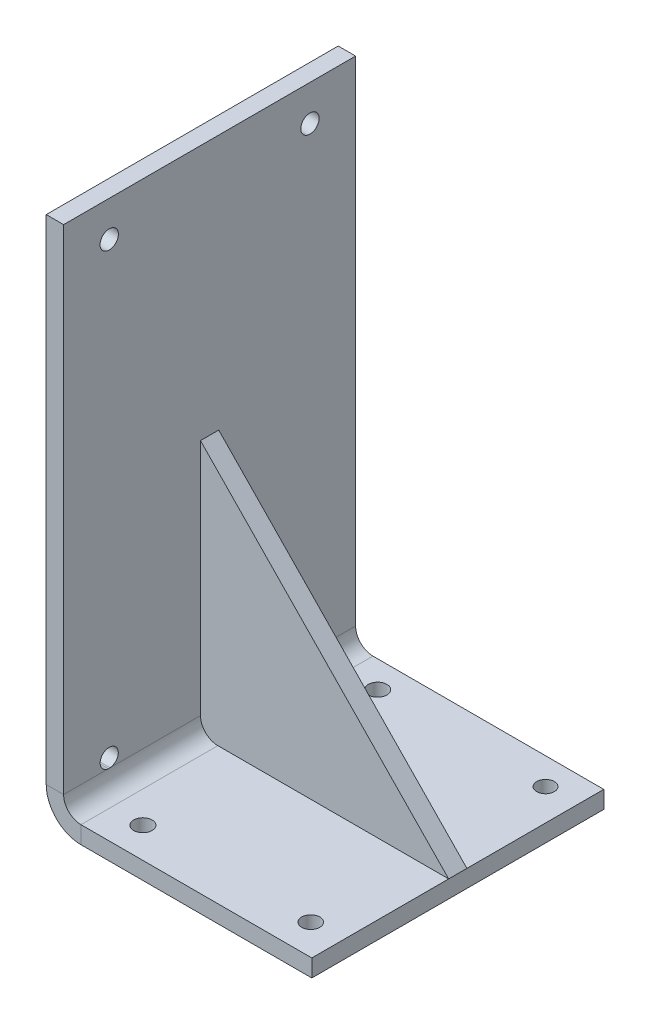
ISO-10303-21;
HEADER;
FILE_DESCRIPTION(('STEP AP214'),'2;1');
FILE_NAME('part.step','',(''),(''),'','','');
FILE_SCHEMA(('AUTOMOTIVE_DESIGN { 1 0 10303 214 1 1 1 1 }'));
ENDSEC;
DATA;
#1=APPLICATION_CONTEXT('core data for automotive mechanical design processes');
#2=APPLICATION_PROTOCOL_DEFINITION('international standard','automotive_design',2000,#1);
#3=PRODUCT_CONTEXT('',#1,'mechanical');
#4=PRODUCT('Part','Part','',(#3));
#5=PRODUCT_RELATED_PRODUCT_CATEGORY('part','',(#4));
#6=PRODUCT_DEFINITION_FORMATION('','',#4);
#7=PRODUCT_DEFINITION_CONTEXT('part definition',#1,'design');
#8=PRODUCT_DEFINITION('design','',#6,#7);
#9=PRODUCT_DEFINITION_SHAPE('','',#8);
#10=(LENGTH_UNIT() NAMED_UNIT(*) SI_UNIT(.MILLI.,.METRE.));
#11=(NAMED_UNIT(*) PLANE_ANGLE_UNIT() SI_UNIT($,.RADIAN.));
#12=(NAMED_UNIT(*) SI_UNIT($,.STERADIAN.) SOLID_ANGLE_UNIT());
#13=UNCERTAINTY_MEASURE_WITH_UNIT(LENGTH_MEASURE(1.E-05),#10,'distance_accuracy_value','');
#14=(GEOMETRIC_REPRESENTATION_CONTEXT(3) GLOBAL_UNCERTAINTY_ASSIGNED_CONTEXT((#13)) GLOBAL_UNIT_ASSIGNED_CONTEXT((#10,
#11,#12)) REPRESENTATION_CONTEXT('',''));
#15=CARTESIAN_POINT('',(0.,0.,0.));
#16=DIRECTION('',(0.,0.,1.));
#17=DIRECTION('',(1.,0.,0.));
#18=AXIS2_PLACEMENT_3D('',#15,#16,#17);
#19=CARTESIAN_POINT('',(4.7625,4.7625,40.));
#20=DIRECTION('',(0.,0.,-1.));
#21=DIRECTION('',(-1.,0.,0.));
#22=AXIS2_PLACEMENT_3D('',#19,#20,#21);
#23=CYLINDRICAL_SURFACE('',#22,9.525);
#24=CARTESIAN_POINT('',(-4.7625,4.7625,-27.2638198002494));
#25=CARTESIAN_POINT('',(-4.76249996387871,4.76062360908471,-27.2834810728059));
#26=CARTESIAN_POINT('',(-4.76249944415007,4.75897974606339,-27.3031645916626));
#27=CARTESIAN_POINT('',(-4.76249800522472,4.75616235389097,-27.3425316768141));
#28=CARTESIAN_POINT('',(-4.76249708670741,4.75498803130408,-27.3622151863417));
#29=CARTESIAN_POINT('',(-4.76249541493604,4.75310967775168,-27.4015822627205));
#30=CARTESIAN_POINT('',(-4.7624946614956,4.75240511457281,-27.421265804155));
#31=CARTESIAN_POINT('',(-4.76249362113549,4.75146595729511,-27.4606329013084));
#32=CARTESIAN_POINT('',(-4.76249333395082,4.75123109621351,-27.4803164506559));
#33=CARTESIAN_POINT('',(-4.76249333395082,4.75123109621351,-27.5196835493509));
#34=CARTESIAN_POINT('',(-4.76249362113549,4.75146595729511,-27.5393670986984));
#35=CARTESIAN_POINT('',(-4.7624946614956,4.75240511457281,-27.5787341958517));
#36=CARTESIAN_POINT('',(-4.76249541493604,4.75310967775168,-27.5984177372863));
#37=CARTESIAN_POINT('',(-4.76249708670741,4.75498803130408,-27.637784813665));
#38=CARTESIAN_POINT('',(-4.76249800522472,4.75616235389097,-27.6574683231927));
#39=CARTESIAN_POINT('',(-4.76249944415007,4.75897974606339,-27.6968354083441));
#40=CARTESIAN_POINT('',(-4.76249996387871,4.76062360908471,-27.7165189272008));
#41=CARTESIAN_POINT('',(-4.7625,4.7625,-27.7361801997574));
#42=B_SPLINE_CURVE_WITH_KNOTS('',3,(#24,#25,#26,#27,#28,#29,#30,#31,#32,#33,#34,#35,#36,#37,#38,
#39,#40,#41),.UNSPECIFIED.,.F.,.F.,(4,2,2,2,2,2,2,2,4),(0.,0.0592505212362607,0.118400492652685,
0.177483335787964,0.236532586165076,0.295581836542175,0.354664679677467,0.413814651093878,
0.473065172330139),.UNSPECIFIED.);
#43=CARTESIAN_POINT('',(-4.7625,4.7625,-27.2638198002494));
#44=VERTEX_POINT('',#43);
#45=CARTESIAN_POINT('',(-4.7625,4.7625,-27.7361801997574));
#46=VERTEX_POINT('',#45);
#47=EDGE_CURVE('E152',#44,#46,#42,.T.);
#48=ORIENTED_EDGE('',*,*,#47,.T.);
#49=DIRECTION('',(0.,0.,-1.));
#50=VECTOR('',#49,1.);
#51=CARTESIAN_POINT('',(-4.7625,4.7625,40.));
#52=LINE('',#51,#50);
#53=CARTESIAN_POINT('',(-4.7625,4.7625,-40.));
#54=VERTEX_POINT('',#53);
#55=EDGE_CURVE('E179',#46,#54,#52,.T.);
#56=ORIENTED_EDGE('',*,*,#55,.T.);
#57=CARTESIAN_POINT('',(4.7625,4.7625,-40.));
#58=DIRECTION('',(0.,0.,1.));
#59=DIRECTION('',(1.,0.,0.));
#60=AXIS2_PLACEMENT_3D('',#57,#58,#59);
#61=CIRCLE('',#60,9.525);
#62=CARTESIAN_POINT('',(4.7625,-4.7625,-40.));
#63=VERTEX_POINT('',#62);
#64=EDGE_CURVE('E270',#54,#63,#61,.T.);
#65=ORIENTED_EDGE('',*,*,#64,.T.);
#66=DIRECTION('',(0.,0.,-1.));
#67=VECTOR('',#66,1.);
#68=CARTESIAN_POINT('',(4.7625,-4.7625,40.));
#69=LINE('',#68,#67);
#70=CARTESIAN_POINT('',(4.7625,-4.7625,40.));
#71=VERTEX_POINT('',#70);
#72=EDGE_CURVE('E186',#71,#63,#69,.T.);
#73=ORIENTED_EDGE('',*,*,#72,.F.);
#74=CARTESIAN_POINT('',(4.7625,4.7625,40.));
#75=DIRECTION('',(0.,0.,1.));
#76=DIRECTION('',(1.,0.,0.));
#77=AXIS2_PLACEMENT_3D('',#74,#75,#76);
#78=CIRCLE('',#77,9.525);
#79=CARTESIAN_POINT('',(-4.7625,4.7625,40.));
#80=VERTEX_POINT('',#79);
#81=EDGE_CURVE('E298',#80,#71,#78,.T.);
#82=ORIENTED_EDGE('',*,*,#81,.F.);
#83=CARTESIAN_POINT('',(-4.7625,4.7625,27.7212775154937));
#84=VERTEX_POINT('',#83);
#85=EDGE_CURVE('E183',#80,#84,#52,.T.);
#86=ORIENTED_EDGE('',*,*,#85,.T.);
#87=DIRECTION('',(0.,0.,-1.));
#88=VECTOR('',#87,1.);
#89=CARTESIAN_POINT('',(-4.7625,4.7625,40.));
#90=LINE('',#89,#88);
#91=CARTESIAN_POINT('',(-4.7625,4.7625,27.2787224844996));
#92=VERTEX_POINT('',#91);
#93=EDGE_CURVE('E182',#84,#92,#90,.T.);
#94=ORIENTED_EDGE('',*,*,#93,.T.);
#95=EDGE_CURVE('E176',#92,#44,#52,.T.);
#96=ORIENTED_EDGE('',*,*,#95,.T.);
#97=EDGE_LOOP('',(#48,#56,#65,#73,#82,#86,#94,#96));
#98=FACE_BOUND('',#97,.T.);
#99=ADVANCED_FACE('F39',(#98),#23,.T.);
#100=CARTESIAN_POINT('',(0.,0.,40.));
#101=DIRECTION('',(0.,1.,0.));
#102=DIRECTION('',(0.,0.,1.));
#103=AXIS2_PLACEMENT_3D('',#100,#101,#102);
#104=PLANE('',#103);
#105=CARTESIAN_POINT('',(59.3690789778464,0.,-32.6724328944059));
#106=DIRECTION('',(0.,1.,0.));
#107=DIRECTION('',(0.,0.,1.));
#108=AXIS2_PLACEMENT_3D('',#105,#106,#107);
#109=CIRCLE('',#108,2.41391972015511);
#110=CARTESIAN_POINT('',(59.3690789778464,0.,-30.2585131742508));
#111=VERTEX_POINT('',#110);
#112=EDGE_CURVE('E676',#111,#111,#109,.T.);
#113=ORIENTED_EDGE('',*,*,#112,.F.);
#114=EDGE_LOOP('',(#113));
#115=FACE_BOUND('',#114,.T.);
#116=CARTESIAN_POINT('',(13.37310013689,0.,-32.6724328944059));
#117=DIRECTION('',(0.,1.,0.));
#118=DIRECTION('',(0.,0.,1.));
#119=AXIS2_PLACEMENT_3D('',#116,#117,#118);
#120=CIRCLE('',#119,2.53741440630367);
#121=CARTESIAN_POINT('',(13.37310013689,0.,-30.1350184881022));
#122=VERTEX_POINT('',#121);
#123=EDGE_CURVE('E673',#122,#122,#120,.T.);
#124=ORIENTED_EDGE('',*,*,#123,.F.);
#125=EDGE_LOOP('',(#124));
#126=FACE_BOUND('',#125,.T.);
#127=DIRECTION('',(0.,0.,-1.));
#128=VECTOR('',#127,1.);
#129=CARTESIAN_POINT('',(4.7625,0.,40.));
#130=LINE('',#129,#128);
#131=CARTESIAN_POINT('',(4.7625,0.,-2.5));
#132=VERTEX_POINT('',#131);
#133=CARTESIAN_POINT('',(4.7625,0.,-40.));
#134=VERTEX_POINT('',#133);
#135=EDGE_CURVE('E198',#132,#134,#130,.T.);
#136=ORIENTED_EDGE('',*,*,#135,.F.);
#137=DIRECTION('',(1.,0.,0.));
#138=VECTOR('',#137,1.);
#139=CARTESIAN_POINT('',(0.,0.,-2.5));
#140=LINE('',#139,#138);
#141=CARTESIAN_POINT('',(68.,0.,-2.5));
#142=VERTEX_POINT('',#141);
#143=EDGE_CURVE('E340',#132,#142,#140,.T.);
#144=ORIENTED_EDGE('',*,*,#143,.T.);
#145=DIRECTION('',(0.,0.,-1.));
#146=VECTOR('',#145,1.);
#147=CARTESIAN_POINT('',(68.,0.,40.));
#148=LINE('',#147,#146);
#149=CARTESIAN_POINT('',(68.,0.,-40.));
#150=VERTEX_POINT('',#149);
#151=EDGE_CURVE('E219',#142,#150,#148,.T.);
#152=ORIENTED_EDGE('',*,*,#151,.T.);
#153=DIRECTION('',(1.,0.,0.));
#154=VECTOR('',#153,1.);
#155=CARTESIAN_POINT('',(0.,0.,-40.));
#156=LINE('',#155,#154);
#157=EDGE_CURVE('E250',#134,#150,#156,.T.);
#158=ORIENTED_EDGE('',*,*,#157,.F.);
#159=EDGE_LOOP('',(#136,#144,#152,#158));
#160=FACE_BOUND('',#159,.T.);
#161=ADVANCED_FACE('F256',(#115,#126,#160),#104,.T.);
#162=CARTESIAN_POINT('',(4.7625,4.7625,40.));
#163=DIRECTION('',(0.,0.,-1.));
#164=DIRECTION('',(-1.,0.,0.));
#165=AXIS2_PLACEMENT_3D('',#162,#163,#164);
#166=CYLINDRICAL_SURFACE('',#165,4.7625);
#167=DIRECTION('',(0.,0.,-1.));
#168=VECTOR('',#167,1.);
#169=CARTESIAN_POINT('',(0.,4.7625,40.));
#170=LINE('',#169,#168);
#171=CARTESIAN_POINT('',(0.,4.7625,-2.5));
#172=VERTEX_POINT('',#171);
#173=CARTESIAN_POINT('',(0.,4.7625,-27.2638198002494));
#174=VERTEX_POINT('',#173);
#175=EDGE_CURVE('E206',#172,#174,#170,.T.);
#176=ORIENTED_EDGE('',*,*,#175,.F.);
#177=CARTESIAN_POINT('',(4.7625,4.7625,-2.5));
#178=DIRECTION('',(0.,0.,1.));
#179=DIRECTION('',(1.,0.,0.));
#180=AXIS2_PLACEMENT_3D('',#177,#178,#179);
#181=CIRCLE('',#180,4.7625);
#182=EDGE_CURVE('E243',#172,#132,#181,.T.);
#183=ORIENTED_EDGE('',*,*,#182,.T.);
#184=ORIENTED_EDGE('',*,*,#135,.T.);
#185=CARTESIAN_POINT('',(4.7625,4.7625,-40.));
#186=DIRECTION('',(0.,0.,-1.));
#187=DIRECTION('',(-1.,0.,0.));
#188=AXIS2_PLACEMENT_3D('',#185,#186,#187);
#189=CIRCLE('',#188,4.7625);
#190=CARTESIAN_POINT('',(0.,4.7625,-40.));
#191=VERTEX_POINT('',#190);
#192=EDGE_CURVE('E241',#191,#134,#189,.F.);
#193=ORIENTED_EDGE('',*,*,#192,.F.);
#194=CARTESIAN_POINT('',(0.,4.7625,-27.7361801997574));
#195=VERTEX_POINT('',#194);
#196=EDGE_CURVE('E193',#195,#191,#170,.T.);
#197=ORIENTED_EDGE('',*,*,#196,.F.);
#198=CARTESIAN_POINT('',(0.,4.7625,-27.2638198002494));
#199=CARTESIAN_POINT('',(0.,4.75493456892617,-27.4223804410417));
#200=CARTESIAN_POINT('',(0.,4.75503995690267,-27.5798283405828));
#201=CARTESIAN_POINT('',(0.,4.7625,-27.7361801997574));
#202=B_SPLINE_CURVE_WITH_KNOTS('',3,(#198,#199,#200,#201),.UNSPECIFIED.,.F.,.F.,(4,4),(0.,
0.000471084587811639),.UNSPECIFIED.);
#203=EDGE_CURVE('E159',#174,#195,#202,.T.);
#204=ORIENTED_EDGE('',*,*,#203,.F.);
#205=EDGE_LOOP('',(#176,#183,#184,#193,#197,#204));
#206=FACE_BOUND('',#205,.T.);
#207=ADVANCED_FACE('F238',(#206),#166,.F.);
#208=CARTESIAN_POINT('',(4.7625,0.,40.));
#209=DIRECTION('',(0.,0.,1.));
#210=DIRECTION('',(1.,0.,0.));
#211=AXIS2_PLACEMENT_3D('',#208,#209,#210);
#212=PLANE('',#211);
#213=DIRECTION('',(0.,-1.,0.));
#214=VECTOR('',#213,1.);
#215=CARTESIAN_POINT('',(4.7625,0.,40.));
#216=LINE('',#215,#214);
#217=CARTESIAN_POINT('',(4.7625,0.,40.));
#218=VERTEX_POINT('',#217);
#219=EDGE_CURVE('E11',#218,#71,#216,.T.);
#220=ORIENTED_EDGE('',*,*,#219,.F.);
#221=CARTESIAN_POINT('',(4.7625,4.7625,40.));
#222=DIRECTION('',(0.,0.,-1.));
#223=DIRECTION('',(-1.,0.,0.));
#224=AXIS2_PLACEMENT_3D('',#221,#222,#223);
#225=CIRCLE('',#224,4.7625);
#226=CARTESIAN_POINT('',(0.,4.7625,40.));
#227=VERTEX_POINT('',#226);
#228=EDGE_CURVE('E287',#227,#218,#225,.F.);
#229=ORIENTED_EDGE('',*,*,#228,.F.);
#230=DIRECTION('',(1.,0.,0.));
#231=VECTOR('',#230,1.);
#232=CARTESIAN_POINT('',(-4.7625,4.7625,40.));
#233=LINE('',#232,#231);
#234=EDGE_CURVE('E48',#80,#227,#233,.T.);
#235=ORIENTED_EDGE('',*,*,#234,.F.);
#236=ORIENTED_EDGE('',*,*,#81,.T.);
#237=EDGE_LOOP('',(#220,#229,#235,#236));
#238=FACE_BOUND('',#237,.T.);
#239=ADVANCED_FACE('F41',(#238),#212,.T.);
#240=CARTESIAN_POINT('',(-4.7625,4.7625,40.));
#241=DIRECTION('',(0.,0.,1.));
#242=DIRECTION('',(1.,0.,0.));
#243=AXIS2_PLACEMENT_3D('',#240,#241,#242);
#244=PLANE('',#243);
#245=DIRECTION('',(1.,0.,0.));
#246=VECTOR('',#245,1.);
#247=CARTESIAN_POINT('',(0.,0.,40.));
#248=LINE('',#247,#246);
#249=CARTESIAN_POINT('',(68.,0.,40.));
#250=VERTEX_POINT('',#249);
#251=EDGE_CURVE('E280',#218,#250,#248,.T.);
#252=ORIENTED_EDGE('',*,*,#251,.F.);
#253=ORIENTED_EDGE('',*,*,#219,.T.);
#254=DIRECTION('',(1.,0.,0.));
#255=VECTOR('',#254,1.);
#256=CARTESIAN_POINT('',(0.,-4.7625,40.));
#257=LINE('',#256,#255);
#258=CARTESIAN_POINT('',(68.,-4.7625,40.));
#259=VERTEX_POINT('',#258);
#260=EDGE_CURVE('E271',#71,#259,#257,.T.);
#261=ORIENTED_EDGE('',*,*,#260,.T.);
#262=DIRECTION('',(0.,-1.,0.));
#263=VECTOR('',#262,1.);
#264=CARTESIAN_POINT('',(68.,0.,40.));
#265=LINE('',#264,#263);
#266=EDGE_CURVE('E273',#250,#259,#265,.T.);
#267=ORIENTED_EDGE('',*,*,#266,.F.);
#268=EDGE_LOOP('',(#252,#253,#261,#267));
#269=FACE_BOUND('',#268,.T.);
#270=ADVANCED_FACE('F396',(#269),#244,.T.);
#271=CARTESIAN_POINT('',(0.,4.7625,-40.));
#272=DIRECTION('',(0.,0.,-1.));
#273=DIRECTION('',(-1.,0.,0.));
#274=AXIS2_PLACEMENT_3D('',#271,#272,#273);
#275=PLANE('',#274);
#276=DIRECTION('',(-1.,0.,0.));
#277=VECTOR('',#276,1.);
#278=CARTESIAN_POINT('',(0.,4.7625,-40.));
#279=LINE('',#278,#277);
#280=EDGE_CURVE('E210',#191,#54,#279,.T.);
#281=ORIENTED_EDGE('',*,*,#280,.F.);
#282=ORIENTED_EDGE('',*,*,#192,.T.);
#283=DIRECTION('',(0.,1.,0.));
#284=VECTOR('',#283,1.);
#285=CARTESIAN_POINT('',(4.7625,-4.7625,-40.));
#286=LINE('',#285,#284);
#287=EDGE_CURVE('E213',#63,#134,#286,.T.);
#288=ORIENTED_EDGE('',*,*,#287,.F.);
#289=ORIENTED_EDGE('',*,*,#64,.F.);
#290=EDGE_LOOP('',(#281,#282,#288,#289));
#291=FACE_BOUND('',#290,.T.);
#292=ADVANCED_FACE('F260',(#291),#275,.T.);
#293=CARTESIAN_POINT('',(4.7625,-4.7625,-40.));
#294=DIRECTION('',(0.,0.,-1.));
#295=DIRECTION('',(-1.,0.,0.));
#296=AXIS2_PLACEMENT_3D('',#293,#294,#295);
#297=PLANE('',#296);
#298=DIRECTION('',(0.,-1.,0.));
#299=VECTOR('',#298,1.);
#300=CARTESIAN_POINT('',(0.,0.,-40.));
#301=LINE('',#300,#299);
#302=CARTESIAN_POINT('',(0.,140.,-40.));
#303=VERTEX_POINT('',#302);
#304=EDGE_CURVE('E261',#303,#191,#301,.T.);
#305=ORIENTED_EDGE('',*,*,#304,.T.);
#306=ORIENTED_EDGE('',*,*,#280,.T.);
#307=DIRECTION('',(0.,1.,0.));
#308=VECTOR('',#307,1.);
#309=CARTESIAN_POINT('',(-4.7625,0.,-40.));
#310=LINE('',#309,#308);
#311=CARTESIAN_POINT('',(-4.7625,140.,-40.));
#312=VERTEX_POINT('',#311);
#313=EDGE_CURVE('E269',#312,#54,#310,.F.);
#314=ORIENTED_EDGE('',*,*,#313,.F.);
#315=DIRECTION('',(1.,0.,0.));
#316=VECTOR('',#315,1.);
#317=CARTESIAN_POINT('',(-4.7625,140.,-40.));
#318=LINE('',#317,#316);
#319=EDGE_CURVE('E263',#312,#303,#318,.T.);
#320=ORIENTED_EDGE('',*,*,#319,.T.);
#321=EDGE_LOOP('',(#305,#306,#314,#320));
#322=FACE_BOUND('',#321,.T.);
#323=ADVANCED_FACE('F390',(#322),#297,.T.);
#324=CARTESIAN_POINT('',(0.,-4.7625,40.));
#325=DIRECTION('',(0.,1.,0.));
#326=DIRECTION('',(0.,0.,1.));
#327=AXIS2_PLACEMENT_3D('',#324,#325,#326);
#328=PLANE('',#327);
#329=CARTESIAN_POINT('',(59.3690789778464,-4.7625,31.6540467392565));
#330=DIRECTION('',(0.,1.,0.));
#331=DIRECTION('',(0.,0.,1.));
#332=AXIS2_PLACEMENT_3D('',#329,#330,#331);
#333=CIRCLE('',#332,2.47355825681685);
#334=CARTESIAN_POINT('',(59.3690789778464,-4.7625,34.1276049960733));
#335=VERTEX_POINT('',#334);
#336=EDGE_CURVE('E669',#335,#335,#333,.T.);
#337=ORIENTED_EDGE('',*,*,#336,.T.);
#338=EDGE_LOOP('',(#337));
#339=FACE_BOUND('',#338,.T.);
#340=CARTESIAN_POINT('',(59.3690789778464,-4.7625,-32.6724328944059));
#341=DIRECTION('',(0.,1.,0.));
#342=DIRECTION('',(0.,0.,1.));
#343=AXIS2_PLACEMENT_3D('',#340,#341,#342);
#344=CIRCLE('',#343,2.41391972015511);
#345=CARTESIAN_POINT('',(59.3690789778464,-4.7625,-30.2585131742508));
#346=VERTEX_POINT('',#345);
#347=EDGE_CURVE('E43',#346,#346,#344,.T.);
#348=ORIENTED_EDGE('',*,*,#347,.T.);
#349=EDGE_LOOP('',(#348));
#350=FACE_BOUND('',#349,.T.);
#351=CARTESIAN_POINT('',(13.37310013689,-4.7625,-32.6724328944059));
#352=DIRECTION('',(0.,1.,0.));
#353=DIRECTION('',(0.,0.,1.));
#354=AXIS2_PLACEMENT_3D('',#351,#352,#353);
#355=CIRCLE('',#354,2.53741440630367);
#356=CARTESIAN_POINT('',(13.37310013689,-4.7625,-30.1350184881022));
#357=VERTEX_POINT('',#356);
#358=EDGE_CURVE('E370',#357,#357,#355,.T.);
#359=ORIENTED_EDGE('',*,*,#358,.T.);
#360=EDGE_LOOP('',(#359));
#361=FACE_BOUND('',#360,.T.);
#362=CARTESIAN_POINT('',(13.37310013689,-4.7625,31.6540467392565));
#363=DIRECTION('',(0.,1.,0.));
#364=DIRECTION('',(0.,0.,1.));
#365=AXIS2_PLACEMENT_3D('',#362,#363,#364);
#366=CIRCLE('',#365,2.51903828989978);
#367=CARTESIAN_POINT('',(13.37310013689,-4.7625,34.1730850291563));
#368=VERTEX_POINT('',#367);
#369=EDGE_CURVE('E160',#368,#368,#366,.T.);
#370=ORIENTED_EDGE('',*,*,#369,.T.);
#371=EDGE_LOOP('',(#370));
#372=FACE_BOUND('',#371,.T.);
#373=ORIENTED_EDGE('',*,*,#72,.T.);
#374=DIRECTION('',(1.,0.,0.));
#375=VECTOR('',#374,1.);
#376=CARTESIAN_POINT('',(0.,-4.7625,-40.));
#377=LINE('',#376,#375);
#378=CARTESIAN_POINT('',(68.,-4.7625,-40.));
#379=VERTEX_POINT('',#378);
#380=EDGE_CURVE('E252',#63,#379,#377,.T.);
#381=ORIENTED_EDGE('',*,*,#380,.T.);
#382=DIRECTION('',(0.,0.,-1.));
#383=VECTOR('',#382,1.);
#384=CARTESIAN_POINT('',(68.,-4.7625,40.));
#385=LINE('',#384,#383);
#386=EDGE_CURVE('E216',#259,#379,#385,.T.);
#387=ORIENTED_EDGE('',*,*,#386,.F.);
#388=ORIENTED_EDGE('',*,*,#260,.F.);
#389=EDGE_LOOP('',(#373,#381,#387,#388));
#390=FACE_BOUND('',#389,.T.);
#391=ADVANCED_FACE('F305',(#339,#350,#361,#372,#390),#328,.F.);
#392=CARTESIAN_POINT('',(68.,0.,40.));
#393=DIRECTION('',(1.,0.,0.));
#394=DIRECTION('',(0.,1.,0.));
#395=AXIS2_PLACEMENT_3D('',#392,#393,#394);
#396=PLANE('',#395);
#397=ORIENTED_EDGE('',*,*,#386,.T.);
#398=DIRECTION('',(0.,-1.,0.));
#399=VECTOR('',#398,1.);
#400=CARTESIAN_POINT('',(68.,0.,-40.));
#401=LINE('',#400,#399);
#402=EDGE_CURVE('E257',#150,#379,#401,.T.);
#403=ORIENTED_EDGE('',*,*,#402,.F.);
#404=ORIENTED_EDGE('',*,*,#151,.F.);
#405=DIRECTION('',(0.,0.,-1.));
#406=VECTOR('',#405,1.);
#407=CARTESIAN_POINT('',(68.,0.,40.));
#408=LINE('',#407,#406);
#409=CARTESIAN_POINT('',(68.,0.,2.5));
#410=VERTEX_POINT('',#409);
#411=EDGE_CURVE('E283',#410,#142,#408,.T.);
#412=ORIENTED_EDGE('',*,*,#411,.F.);
#413=EDGE_CURVE('E217',#250,#410,#148,.T.);
#414=ORIENTED_EDGE('',*,*,#413,.F.);
#415=ORIENTED_EDGE('',*,*,#266,.T.);
#416=EDGE_LOOP('',(#397,#403,#404,#412,#414,#415));
#417=FACE_BOUND('',#416,.T.);
#418=ADVANCED_FACE('F302',(#417),#396,.T.);
#419=CARTESIAN_POINT('',(59.3690789778464,0.,31.6540467392565));
#420=DIRECTION('',(0.,1.,0.));
#421=DIRECTION('',(0.,0.,1.));
#422=AXIS2_PLACEMENT_3D('',#419,#420,#421);
#423=CIRCLE('',#422,2.47355825681685);
#424=CARTESIAN_POINT('',(59.3690789778464,0.,34.1276049960733));
#425=VERTEX_POINT('',#424);
#426=EDGE_CURVE('E672',#425,#425,#423,.T.);
#427=ORIENTED_EDGE('',*,*,#426,.F.);
#428=EDGE_LOOP('',(#427));
#429=FACE_BOUND('',#428,.T.);
#430=CARTESIAN_POINT('',(13.37310013689,0.,31.6540467392565));
#431=DIRECTION('',(0.,1.,0.));
#432=DIRECTION('',(0.,0.,1.));
#433=AXIS2_PLACEMENT_3D('',#430,#431,#432);
#434=CIRCLE('',#433,2.51903828989978);
#435=CARTESIAN_POINT('',(13.37310013689,0.,34.1730850291563));
#436=VERTEX_POINT('',#435);
#437=EDGE_CURVE('E666',#436,#436,#434,.T.);
#438=ORIENTED_EDGE('',*,*,#437,.F.);
#439=EDGE_LOOP('',(#438));
#440=FACE_BOUND('',#439,.T.);
#441=DIRECTION('',(1.,0.,0.));
#442=VECTOR('',#441,1.);
#443=CARTESIAN_POINT('',(0.,0.,2.5));
#444=LINE('',#443,#442);
#445=CARTESIAN_POINT('',(4.7625,0.,2.5));
#446=VERTEX_POINT('',#445);
#447=EDGE_CURVE('E348',#446,#410,#444,.T.);
#448=ORIENTED_EDGE('',*,*,#447,.F.);
#449=EDGE_CURVE('E200',#218,#446,#130,.T.);
#450=ORIENTED_EDGE('',*,*,#449,.F.);
#451=ORIENTED_EDGE('',*,*,#251,.T.);
#452=ORIENTED_EDGE('',*,*,#413,.T.);
#453=EDGE_LOOP('',(#448,#450,#451,#452));
#454=FACE_BOUND('',#453,.T.);
#455=ADVANCED_FACE('F381',(#429,#440,#454),#104,.T.);
#456=CARTESIAN_POINT('',(4.7625,4.7625,2.5));
#457=DIRECTION('',(0.,0.,1.));
#458=DIRECTION('',(1.,0.,0.));
#459=AXIS2_PLACEMENT_3D('',#456,#457,#458);
#460=CIRCLE('',#459,4.7625);
#461=CARTESIAN_POINT('',(0.,4.7625,2.5));
#462=VERTEX_POINT('',#461);
#463=EDGE_CURVE('E350',#462,#446,#460,.T.);
#464=ORIENTED_EDGE('',*,*,#463,.F.);
#465=CARTESIAN_POINT('',(0.,4.7625,27.2787224844996));
#466=VERTEX_POINT('',#465);
#467=EDGE_CURVE('E199',#466,#462,#170,.T.);
#468=ORIENTED_EDGE('',*,*,#467,.F.);
#469=DIRECTION('',(0.,0.,-1.));
#470=VECTOR('',#469,1.);
#471=CARTESIAN_POINT('',(0.,4.7625,40.));
#472=LINE('',#471,#470);
#473=CARTESIAN_POINT('',(0.,4.7625,27.7212775154937));
#474=VERTEX_POINT('',#473);
#475=EDGE_CURVE('E169',#474,#466,#472,.T.);
#476=ORIENTED_EDGE('',*,*,#475,.F.);
#477=EDGE_CURVE('E194',#227,#474,#170,.T.);
#478=ORIENTED_EDGE('',*,*,#477,.F.);
#479=ORIENTED_EDGE('',*,*,#228,.T.);
#480=ORIENTED_EDGE('',*,*,#449,.T.);
#481=EDGE_LOOP('',(#464,#468,#476,#478,#479,#480));
#482=FACE_BOUND('',#481,.T.);
#483=ADVANCED_FACE('F371',(#482),#166,.F.);
#484=CARTESIAN_POINT('',(0.,0.,40.));
#485=DIRECTION('',(1.,0.,0.));
#486=DIRECTION('',(0.,0.,-1.));
#487=AXIS2_PLACEMENT_3D('',#484,#485,#486);
#488=PLANE('',#487);
#489=CARTESIAN_POINT('',(0.,130.237499999998,-27.5000000000034));
#490=DIRECTION('',(1.,0.,0.));
#491=DIRECTION('',(0.,0.,-1.));
#492=AXIS2_PLACEMENT_3D('',#489,#490,#491);
#493=CIRCLE('',#492,2.50801824007192);
#494=CARTESIAN_POINT('',(0.,130.237499999998,-30.0080182400753));
#495=VERTEX_POINT('',#494);
#496=EDGE_CURVE('E327',#495,#495,#493,.T.);
#497=ORIENTED_EDGE('',*,*,#496,.F.);
#498=EDGE_LOOP('',(#497));
#499=FACE_BOUND('',#498,.T.);
#500=CARTESIAN_POINT('',(0.,130.237499999998,27.4999999999966));
#501=DIRECTION('',(1.,0.,0.));
#502=DIRECTION('',(0.,0.,-1.));
#503=AXIS2_PLACEMENT_3D('',#500,#501,#502);
#504=CIRCLE('',#503,2.51510559759046);
#505=CARTESIAN_POINT('',(0.,130.237499999998,24.9848944024062));
#506=VERTEX_POINT('',#505);
#507=EDGE_CURVE('E333',#506,#506,#504,.T.);
#508=ORIENTED_EDGE('',*,*,#507,.F.);
#509=EDGE_LOOP('',(#508));
#510=FACE_BOUND('',#509,.T.);
#511=ORIENTED_EDGE('',*,*,#175,.T.);
#512=CARTESIAN_POINT('',(0.,7.23749999999844,-27.5000000000034));
#513=DIRECTION('',(1.,0.,0.));
#514=DIRECTION('',(0.,0.,-1.));
#515=AXIS2_PLACEMENT_3D('',#512,#513,#514);
#516=CIRCLE('',#515,2.48624336836684);
#517=EDGE_CURVE('E167',#195,#174,#516,.T.);
#518=ORIENTED_EDGE('',*,*,#517,.F.);
#519=ORIENTED_EDGE('',*,*,#196,.T.);
#520=ORIENTED_EDGE('',*,*,#304,.F.);
#521=DIRECTION('',(0.,0.,-1.));
#522=VECTOR('',#521,1.);
#523=CARTESIAN_POINT('',(0.,140.,40.));
#524=LINE('',#523,#522);
#525=CARTESIAN_POINT('',(0.,140.,40.));
#526=VERTEX_POINT('',#525);
#527=EDGE_CURVE('E191',#526,#303,#524,.T.);
#528=ORIENTED_EDGE('',*,*,#527,.F.);
#529=DIRECTION('',(0.,-1.,0.));
#530=VECTOR('',#529,1.);
#531=CARTESIAN_POINT('',(0.,0.,40.));
#532=LINE('',#531,#530);
#533=EDGE_CURVE('E289',#526,#227,#532,.T.);
#534=ORIENTED_EDGE('',*,*,#533,.T.);
#535=ORIENTED_EDGE('',*,*,#477,.T.);
#536=CARTESIAN_POINT('',(0.,7.23749999999844,27.4999999999966));
#537=DIRECTION('',(1.,0.,0.));
#538=DIRECTION('',(0.,0.,-1.));
#539=AXIS2_PLACEMENT_3D('',#536,#537,#538);
#540=CIRCLE('',#539,2.48487197635146);
#541=EDGE_CURVE('E321',#466,#474,#540,.T.);
#542=ORIENTED_EDGE('',*,*,#541,.F.);
#543=ORIENTED_EDGE('',*,*,#467,.T.);
#544=DIRECTION('',(0.,-1.,0.));
#545=VECTOR('',#544,1.);
#546=CARTESIAN_POINT('',(0.,0.,2.5));
#547=LINE('',#546,#545);
#548=CARTESIAN_POINT('',(0.,70.,2.5));
#549=VERTEX_POINT('',#548);
#550=EDGE_CURVE('E352',#549,#462,#547,.T.);
#551=ORIENTED_EDGE('',*,*,#550,.F.);
#552=DIRECTION('',(0.,0.,1.));
#553=VECTOR('',#552,1.);
#554=CARTESIAN_POINT('',(0.,70.,40.));
#555=LINE('',#554,#553);
#556=CARTESIAN_POINT('',(0.,70.,-2.5));
#557=VERTEX_POINT('',#556);
#558=EDGE_CURVE('E354',#557,#549,#555,.T.);
#559=ORIENTED_EDGE('',*,*,#558,.F.);
#560=DIRECTION('',(0.,-1.,0.));
#561=VECTOR('',#560,1.);
#562=CARTESIAN_POINT('',(0.,0.,-2.5));
#563=LINE('',#562,#561);
#564=EDGE_CURVE('E345',#557,#172,#563,.T.);
#565=ORIENTED_EDGE('',*,*,#564,.T.);
#566=EDGE_LOOP('',(#511,#518,#519,#520,#528,#534,#535,#542,#543,#551,#559,#565));
#567=FACE_BOUND('',#566,.T.);
#568=ADVANCED_FACE('F363',(#499,#510,#567),#488,.T.);
#569=CARTESIAN_POINT('',(-4.7625,140.,40.));
#570=DIRECTION('',(0.,1.,0.));
#571=DIRECTION('',(-1.,0.,0.));
#572=AXIS2_PLACEMENT_3D('',#569,#570,#571);
#573=PLANE('',#572);
#574=ORIENTED_EDGE('',*,*,#319,.F.);
#575=DIRECTION('',(0.,0.,-1.));
#576=VECTOR('',#575,1.);
#577=CARTESIAN_POINT('',(-4.7625,140.,40.));
#578=LINE('',#577,#576);
#579=CARTESIAN_POINT('',(-4.7625,140.,40.));
#580=VERTEX_POINT('',#579);
#581=EDGE_CURVE('E185',#580,#312,#578,.T.);
#582=ORIENTED_EDGE('',*,*,#581,.F.);
#583=DIRECTION('',(1.,0.,0.));
#584=VECTOR('',#583,1.);
#585=CARTESIAN_POINT('',(-4.7625,140.,40.));
#586=LINE('',#585,#584);
#587=EDGE_CURVE('E292',#580,#526,#586,.T.);
#588=ORIENTED_EDGE('',*,*,#587,.T.);
#589=ORIENTED_EDGE('',*,*,#527,.T.);
#590=EDGE_LOOP('',(#574,#582,#588,#589));
#591=FACE_BOUND('',#590,.T.);
#592=ADVANCED_FACE('F412',(#591),#573,.T.);
#593=CARTESIAN_POINT('',(-4.7625,0.,40.));
#594=DIRECTION('',(1.,0.,0.));
#595=DIRECTION('',(0.,0.,-1.));
#596=AXIS2_PLACEMENT_3D('',#593,#594,#595);
#597=PLANE('',#596);
#598=CARTESIAN_POINT('',(-4.7625,7.23749999999844,-27.5000000000034));
#599=DIRECTION('',(1.,0.,0.));
#600=DIRECTION('',(0.,0.,-1.));
#601=AXIS2_PLACEMENT_3D('',#598,#599,#600);
#602=CIRCLE('',#601,2.48624336836684);
#603=EDGE_CURVE('E165',#46,#44,#602,.T.);
#604=ORIENTED_EDGE('',*,*,#603,.T.);
#605=ORIENTED_EDGE('',*,*,#95,.F.);
#606=CARTESIAN_POINT('',(-4.7625,7.23749999999844,27.4999999999966));
#607=DIRECTION('',(1.,0.,0.));
#608=DIRECTION('',(0.,0.,-1.));
#609=AXIS2_PLACEMENT_3D('',#606,#607,#608);
#610=CIRCLE('',#609,2.48487197635146);
#611=EDGE_CURVE('E316',#92,#84,#610,.T.);
#612=ORIENTED_EDGE('',*,*,#611,.T.);
#613=ORIENTED_EDGE('',*,*,#85,.F.);
#614=DIRECTION('',(0.,1.,0.));
#615=VECTOR('',#614,1.);
#616=CARTESIAN_POINT('',(-4.7625,0.,40.));
#617=LINE('',#616,#615);
#618=EDGE_CURVE('E295',#580,#80,#617,.F.);
#619=ORIENTED_EDGE('',*,*,#618,.F.);
#620=ORIENTED_EDGE('',*,*,#581,.T.);
#621=ORIENTED_EDGE('',*,*,#313,.T.);
#622=ORIENTED_EDGE('',*,*,#55,.F.);
#623=EDGE_LOOP('',(#604,#605,#612,#613,#619,#620,#621,#622));
#624=FACE_BOUND('',#623,.T.);
#625=CARTESIAN_POINT('',(-4.7625,130.237499999998,-27.5000000000034));
#626=DIRECTION('',(1.,0.,0.));
#627=DIRECTION('',(0.,0.,-1.));
#628=AXIS2_PLACEMENT_3D('',#625,#626,#627);
#629=CIRCLE('',#628,2.50801824007192);
#630=CARTESIAN_POINT('',(-4.7625,130.237499999998,-30.0080182400753));
#631=VERTEX_POINT('',#630);
#632=EDGE_CURVE('E336',#631,#631,#629,.T.);
#633=ORIENTED_EDGE('',*,*,#632,.T.);
#634=EDGE_LOOP('',(#633));
#635=FACE_BOUND('',#634,.T.);
#636=CARTESIAN_POINT('',(-4.7625,130.237499999998,27.4999999999966));
#637=DIRECTION('',(1.,0.,0.));
#638=DIRECTION('',(0.,0.,-1.));
#639=AXIS2_PLACEMENT_3D('',#636,#637,#638);
#640=CIRCLE('',#639,2.51510559759046);
#641=CARTESIAN_POINT('',(-4.7625,130.237499999998,24.9848944024062));
#642=VERTEX_POINT('',#641);
#643=EDGE_CURVE('E329',#642,#642,#640,.T.);
#644=ORIENTED_EDGE('',*,*,#643,.T.);
#645=EDGE_LOOP('',(#644));
#646=FACE_BOUND('',#645,.T.);
#647=ADVANCED_FACE('F173',(#624,#635,#646),#597,.F.);
#648=CARTESIAN_POINT('',(4.7625,4.7625,40.));
#649=DIRECTION('',(0.,0.,-1.));
#650=DIRECTION('',(-1.,0.,0.));
#651=AXIS2_PLACEMENT_3D('',#648,#649,#650);
#652=PLANE('',#651);
#653=ORIENTED_EDGE('',*,*,#618,.T.);
#654=ORIENTED_EDGE('',*,*,#234,.T.);
#655=ORIENTED_EDGE('',*,*,#533,.F.);
#656=ORIENTED_EDGE('',*,*,#587,.F.);
#657=EDGE_LOOP('',(#653,#654,#655,#656));
#658=FACE_BOUND('',#657,.T.);
#659=ADVANCED_FACE('F315',(#658),#652,.F.);
#660=CARTESIAN_POINT('',(4.7625,4.7625,-40.));
#661=DIRECTION('',(0.,0.,-1.));
#662=DIRECTION('',(-1.,0.,0.));
#663=AXIS2_PLACEMENT_3D('',#660,#661,#662);
#664=PLANE('',#663);
#665=ORIENTED_EDGE('',*,*,#380,.F.);
#666=ORIENTED_EDGE('',*,*,#287,.T.);
#667=ORIENTED_EDGE('',*,*,#157,.T.);
#668=ORIENTED_EDGE('',*,*,#402,.T.);
#669=EDGE_LOOP('',(#665,#666,#667,#668));
#670=FACE_BOUND('',#669,.T.);
#671=ADVANCED_FACE('F248',(#670),#664,.T.);
#672=CARTESIAN_POINT('',(31.61875,67.61875,2.5));
#673=DIRECTION('',(0.,0.,1.));
#674=DIRECTION('',(1.,0.,0.));
#675=AXIS2_PLACEMENT_3D('',#672,#673,#674);
#676=PLANE('',#675);
#677=DIRECTION('',(-0.696785684263249,0.717279380859227,0.));
#678=VECTOR('',#677,1.);
#679=CARTESIAN_POINT('',(68.,0.,2.5));
#680=LINE('',#679,#678);
#681=EDGE_CURVE('E337',#410,#549,#680,.T.);
#682=ORIENTED_EDGE('',*,*,#681,.T.);
#683=ORIENTED_EDGE('',*,*,#550,.T.);
#684=ORIENTED_EDGE('',*,*,#463,.T.);
#685=ORIENTED_EDGE('',*,*,#447,.T.);
#686=EDGE_LOOP('',(#682,#683,#684,#685));
#687=FACE_BOUND('',#686,.T.);
#688=ADVANCED_FACE('F456',(#687),#676,.T.);
#689=CARTESIAN_POINT('',(31.61875,67.61875,-2.5));
#690=DIRECTION('',(0.,0.,1.));
#691=DIRECTION('',(1.,0.,0.));
#692=AXIS2_PLACEMENT_3D('',#689,#690,#691);
#693=PLANE('',#692);
#694=ORIENTED_EDGE('',*,*,#564,.F.);
#695=DIRECTION('',(-0.696785684263249,0.717279380859227,0.));
#696=VECTOR('',#695,1.);
#697=CARTESIAN_POINT('',(68.,0.,-2.5));
#698=LINE('',#697,#696);
#699=EDGE_CURVE('E332',#142,#557,#698,.T.);
#700=ORIENTED_EDGE('',*,*,#699,.F.);
#701=ORIENTED_EDGE('',*,*,#143,.F.);
#702=ORIENTED_EDGE('',*,*,#182,.F.);
#703=EDGE_LOOP('',(#694,#700,#701,#702));
#704=FACE_BOUND('',#703,.T.);
#705=ADVANCED_FACE('F361',(#704),#693,.F.);
#706=CARTESIAN_POINT('',(68.,0.,0.));
#707=DIRECTION('',(0.717279380859227,0.696785684263249,0.));
#708=DIRECTION('',(-0.696785684263249,0.717279380859227,0.));
#709=AXIS2_PLACEMENT_3D('',#706,#707,#708);
#710=PLANE('',#709);
#711=ORIENTED_EDGE('',*,*,#681,.F.);
#712=ORIENTED_EDGE('',*,*,#411,.T.);
#713=ORIENTED_EDGE('',*,*,#699,.T.);
#714=ORIENTED_EDGE('',*,*,#558,.T.);
#715=EDGE_LOOP('',(#711,#712,#713,#714));
#716=FACE_BOUND('',#715,.T.);
#717=ADVANCED_FACE('F359',(#716),#710,.T.);
#718=CARTESIAN_POINT('',(0.,130.237499999998,27.4999999999966));
#719=DIRECTION('',(1.,0.,0.));
#720=DIRECTION('',(0.,0.,-1.));
#721=AXIS2_PLACEMENT_3D('',#718,#719,#720);
#722=CYLINDRICAL_SURFACE('',#721,2.51510559759046);
#723=ORIENTED_EDGE('',*,*,#643,.F.);
#724=EDGE_LOOP('',(#723));
#725=FACE_BOUND('',#724,.T.);
#726=ORIENTED_EDGE('',*,*,#507,.T.);
#727=EDGE_LOOP('',(#726));
#728=FACE_BOUND('',#727,.T.);
#729=ADVANCED_FACE('F440',(#725,#728),#722,.F.);
#730=CARTESIAN_POINT('',(0.,4.7625,40.));
#731=DIRECTION('',(0.,-1.,0.));
#732=DIRECTION('',(0.,0.,-1.));
#733=AXIS2_PLACEMENT_3D('',#730,#731,#732);
#734=PLANE('',#733);
#735=DIRECTION('',(1.,0.,0.));
#736=VECTOR('',#735,1.);
#737=CARTESIAN_POINT('',(0.,4.7625,27.7212775154937));
#738=LINE('',#737,#736);
#739=EDGE_CURVE('E319',#474,#84,#738,.F.);
#740=ORIENTED_EDGE('',*,*,#739,.F.);
#741=ORIENTED_EDGE('',*,*,#475,.T.);
#742=DIRECTION('',(1.,0.,0.));
#743=VECTOR('',#742,1.);
#744=CARTESIAN_POINT('',(0.,4.7625,27.2787224844996));
#745=LINE('',#744,#743);
#746=EDGE_CURVE('E56',#466,#92,#745,.F.);
#747=ORIENTED_EDGE('',*,*,#746,.T.);
#748=ORIENTED_EDGE('',*,*,#93,.F.);
#749=EDGE_LOOP('',(#740,#741,#747,#748));
#750=FACE_BOUND('',#749,.T.);
#751=ADVANCED_FACE('F442',(#750),#734,.F.);
#752=CARTESIAN_POINT('',(0.,7.23749999999844,27.4999999999966));
#753=DIRECTION('',(1.,0.,0.));
#754=DIRECTION('',(0.,0.,-1.));
#755=AXIS2_PLACEMENT_3D('',#752,#753,#754);
#756=CYLINDRICAL_SURFACE('',#755,2.48487197635146);
#757=ORIENTED_EDGE('',*,*,#541,.T.);
#758=ORIENTED_EDGE('',*,*,#739,.T.);
#759=ORIENTED_EDGE('',*,*,#611,.F.);
#760=ORIENTED_EDGE('',*,*,#746,.F.);
#761=EDGE_LOOP('',(#757,#758,#759,#760));
#762=FACE_BOUND('',#761,.T.);
#763=ADVANCED_FACE('F449',(#762),#756,.F.);
#764=CARTESIAN_POINT('',(0.,7.23749999999844,-27.5000000000034));
#765=DIRECTION('',(1.,0.,0.));
#766=DIRECTION('',(0.,0.,-1.));
#767=AXIS2_PLACEMENT_3D('',#764,#765,#766);
#768=CYLINDRICAL_SURFACE('',#767,2.48624336836684);
#769=ORIENTED_EDGE('',*,*,#517,.T.);
#770=DIRECTION('',(1.,0.,0.));
#771=VECTOR('',#770,1.);
#772=CARTESIAN_POINT('',(0.,4.7625,-27.2638198002494));
#773=LINE('',#772,#771);
#774=EDGE_CURVE('E64',#174,#44,#773,.F.);
#775=ORIENTED_EDGE('',*,*,#774,.T.);
#776=ORIENTED_EDGE('',*,*,#603,.F.);
#777=DIRECTION('',(1.,0.,0.));
#778=VECTOR('',#777,1.);
#779=CARTESIAN_POINT('',(0.,4.7625,-27.7361801997574));
#780=LINE('',#779,#778);
#781=EDGE_CURVE('E154',#195,#46,#780,.F.);
#782=ORIENTED_EDGE('',*,*,#781,.F.);
#783=EDGE_LOOP('',(#769,#775,#776,#782));
#784=FACE_BOUND('',#783,.T.);
#785=ADVANCED_FACE('F164',(#784),#768,.F.);
#786=CARTESIAN_POINT('',(0.047625,4.7625,-27.2638198002494));
#787=CARTESIAN_POINT('',(0.047625,4.75501020989632,-27.4223805808415));
#788=CARTESIAN_POINT('',(0.0476249999999991,4.75511454399844,-27.5798282008394));
#789=CARTESIAN_POINT('',(0.0476249999999991,4.7625,-27.7361801997574));
#790=CARTESIAN_POINT('',(0.,4.7625,-27.2638198002494));
#791=CARTESIAN_POINT('',(0.,4.75493456892617,-27.4223804410417));
#792=CARTESIAN_POINT('',(0.,4.75503995690267,-27.5798283405828));
#793=CARTESIAN_POINT('',(0.,4.7625,-27.7361801997574));
#794=CARTESIAN_POINT('',(-4.7625,4.7625,-27.2638198002494));
#795=CARTESIAN_POINT('',(-4.7625,4.74737047191084,-27.4223664610602));
#796=CARTESIAN_POINT('',(-4.7625,4.74758124732521,-27.5798423149196));
#797=CARTESIAN_POINT('',(-4.7625,4.7625,-27.7361801997574));
#798=B_SPLINE_SURFACE_WITH_KNOTS('',1,3,((#786,#787,#788,#789),(#790,#791,#792,#793),(#794,#795,
#796,#797)),.UNSPECIFIED.,.F.,.F.,.F.,(2,1,2),(4,4),(-0.01,0.,1.),(0.,0.000471084587811639),.UNSPECIFIED.);
#799=ORIENTED_EDGE('',*,*,#781,.T.);
#800=ORIENTED_EDGE('',*,*,#47,.F.);
#801=ORIENTED_EDGE('',*,*,#774,.F.);
#802=ORIENTED_EDGE('',*,*,#203,.T.);
#803=EDGE_LOOP('',(#799,#800,#801,#802));
#804=FACE_BOUND('',#803,.T.);
#805=ADVANCED_FACE('F153',(#804),#798,.F.);
#806=CARTESIAN_POINT('',(0.,130.237499999998,-27.5000000000034));
#807=DIRECTION('',(1.,0.,0.));
#808=DIRECTION('',(0.,0.,-1.));
#809=AXIS2_PLACEMENT_3D('',#806,#807,#808);
#810=CYLINDRICAL_SURFACE('',#809,2.50801824007192);
#811=ORIENTED_EDGE('',*,*,#632,.F.);
#812=EDGE_LOOP('',(#811));
#813=FACE_BOUND('',#812,.T.);
#814=ORIENTED_EDGE('',*,*,#496,.T.);
#815=EDGE_LOOP('',(#814));
#816=FACE_BOUND('',#815,.T.);
#817=ADVANCED_FACE('F436',(#813,#816),#810,.F.);
#818=CARTESIAN_POINT('',(13.37310013689,-10.,31.6540467392565));
#819=DIRECTION('',(0.,1.,0.));
#820=DIRECTION('',(0.,0.,1.));
#821=AXIS2_PLACEMENT_3D('',#818,#819,#820);
#822=CYLINDRICAL_SURFACE('',#821,2.51903828989978);
#823=ORIENTED_EDGE('',*,*,#437,.T.);
#824=EDGE_LOOP('',(#823));
#825=FACE_BOUND('',#824,.T.);
#826=ORIENTED_EDGE('',*,*,#369,.F.);
#827=EDGE_LOOP('',(#826));
#828=FACE_BOUND('',#827,.T.);
#829=ADVANCED_FACE('F564',(#825,#828),#822,.F.);
#830=CARTESIAN_POINT('',(59.3690789778464,-10.,31.6540467392565));
#831=DIRECTION('',(0.,1.,0.));
#832=DIRECTION('',(0.,0.,1.));
#833=AXIS2_PLACEMENT_3D('',#830,#831,#832);
#834=CYLINDRICAL_SURFACE('',#833,2.47355825681685);
#835=ORIENTED_EDGE('',*,*,#426,.T.);
#836=EDGE_LOOP('',(#835));
#837=FACE_BOUND('',#836,.T.);
#838=ORIENTED_EDGE('',*,*,#336,.F.);
#839=EDGE_LOOP('',(#838));
#840=FACE_BOUND('',#839,.T.);
#841=ADVANCED_FACE('F595',(#837,#840),#834,.F.);
#842=CARTESIAN_POINT('',(13.37310013689,-10.,-32.6724328944059));
#843=DIRECTION('',(0.,1.,0.));
#844=DIRECTION('',(0.,0.,1.));
#845=AXIS2_PLACEMENT_3D('',#842,#843,#844);
#846=CYLINDRICAL_SURFACE('',#845,2.53741440630367);
#847=ORIENTED_EDGE('',*,*,#123,.T.);
#848=EDGE_LOOP('',(#847));
#849=FACE_BOUND('',#848,.T.);
#850=ORIENTED_EDGE('',*,*,#358,.F.);
#851=EDGE_LOOP('',(#850));
#852=FACE_BOUND('',#851,.T.);
#853=ADVANCED_FACE('F606',(#849,#852),#846,.F.);
#854=CARTESIAN_POINT('',(59.3690789778464,-10.,-32.6724328944059));
#855=DIRECTION('',(0.,1.,0.));
#856=DIRECTION('',(0.,0.,1.));
#857=AXIS2_PLACEMENT_3D('',#854,#855,#856);
#858=CYLINDRICAL_SURFACE('',#857,2.41391972015511);
#859=ORIENTED_EDGE('',*,*,#112,.T.);
#860=EDGE_LOOP('',(#859));
#861=FACE_BOUND('',#860,.T.);
#862=ORIENTED_EDGE('',*,*,#347,.F.);
#863=EDGE_LOOP('',(#862));
#864=FACE_BOUND('',#863,.T.);
#865=ADVANCED_FACE('F617',(#861,#864),#858,.F.);
#866=CLOSED_SHELL('',(#99,#161,#207,#239,#270,#292,#323,#391,#418,#455,#483,#568,#592,#647,#659,
#671,#688,#705,#717,#729,#751,#763,#785,#805,#817,#829,#841,#853,#865));
#867=MANIFOLD_SOLID_BREP('B2',#866);
#868=ADVANCED_BREP_SHAPE_REPRESENTATION('',(#18,#867),#14);
#869=SHAPE_DEFINITION_REPRESENTATION(#9,#868);
ENDSEC;
END-ISO-10303-21;
